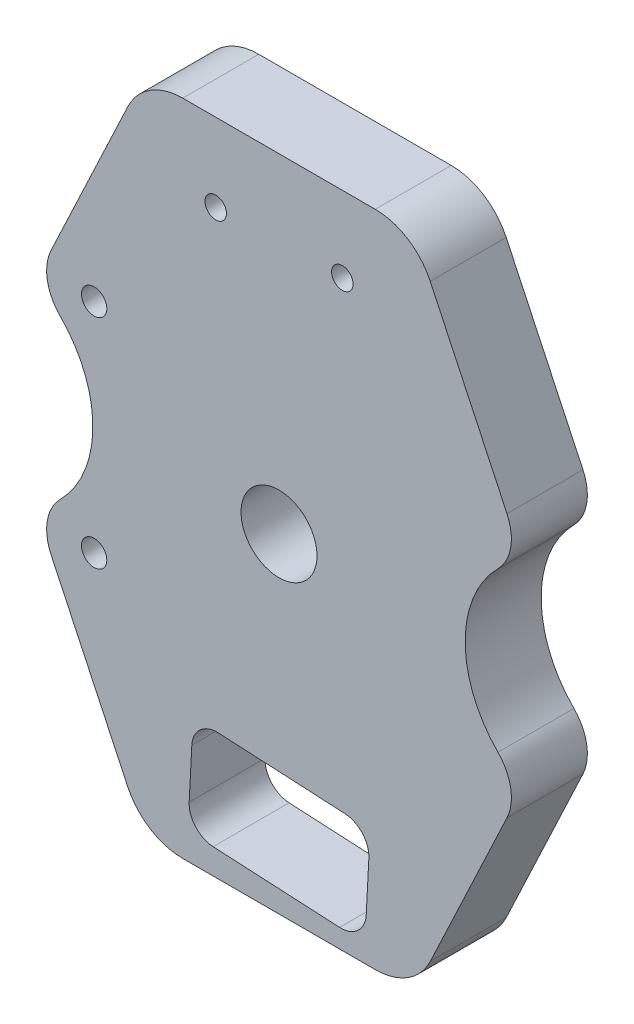
ISO-10303-21;
HEADER;
FILE_DESCRIPTION(('STEP AP214'),'2;1');
FILE_NAME('part.step','',(''),(''),'','','');
FILE_SCHEMA(('AUTOMOTIVE_DESIGN { 1 0 10303 214 1 1 1 1 }'));
ENDSEC;
DATA;
#1=APPLICATION_CONTEXT('core data for automotive mechanical design processes');
#2=APPLICATION_PROTOCOL_DEFINITION('international standard','automotive_design',2000,#1);
#3=PRODUCT_CONTEXT('',#1,'mechanical');
#4=PRODUCT('Part','Part','',(#3));
#5=PRODUCT_RELATED_PRODUCT_CATEGORY('part','',(#4));
#6=PRODUCT_DEFINITION_FORMATION('','',#4);
#7=PRODUCT_DEFINITION_CONTEXT('part definition',#1,'design');
#8=PRODUCT_DEFINITION('design','',#6,#7);
#9=PRODUCT_DEFINITION_SHAPE('','',#8);
#10=(LENGTH_UNIT() NAMED_UNIT(*) SI_UNIT(.MILLI.,.METRE.));
#11=(NAMED_UNIT(*) PLANE_ANGLE_UNIT() SI_UNIT($,.RADIAN.));
#12=(NAMED_UNIT(*) SI_UNIT($,.STERADIAN.) SOLID_ANGLE_UNIT());
#13=UNCERTAINTY_MEASURE_WITH_UNIT(LENGTH_MEASURE(1.E-05),#10,'distance_accuracy_value','');
#14=(GEOMETRIC_REPRESENTATION_CONTEXT(3) GLOBAL_UNCERTAINTY_ASSIGNED_CONTEXT((#13)) GLOBAL_UNIT_ASSIGNED_CONTEXT((#10,
#11,#12)) REPRESENTATION_CONTEXT('',''));
#15=CARTESIAN_POINT('',(0.,0.,0.));
#16=DIRECTION('',(0.,0.,1.));
#17=DIRECTION('',(1.,0.,0.));
#18=AXIS2_PLACEMENT_3D('',#15,#16,#17);
#19=CARTESIAN_POINT('',(38.0693004201398,23.9998999467089,-30.));
#20=DIRECTION('',(0.,0.,1.));
#21=DIRECTION('',(-1.,0.,0.));
#22=AXIS2_PLACEMENT_3D('',#19,#20,#21);
#23=PLANE('',#22);
#24=DIRECTION('',(-0.998629534754574,0.0523359562429441,0.));
#25=VECTOR('',#24,1.);
#26=CARTESIAN_POINT('',(-35.998752841269,10.5489732913392,-30.));
#27=LINE('',#26,#25);
#28=CARTESIAN_POINT('',(23.9190192440055,7.4088159167626,-30.));
#29=VERTEX_POINT('',#28);
#30=CARTESIAN_POINT('',(-26.0124574937233,10.0256137289098,-30.));
#31=VERTEX_POINT('',#30);
#32=EDGE_CURVE('E537',#29,#31,#27,.T.);
#33=ORIENTED_EDGE('',*,*,#32,.F.);
#34=CARTESIAN_POINT('',(24.4423788064349,17.3951112643083,-30.));
#35=DIRECTION('',(0.,0.,-1.));
#36=DIRECTION('',(-1.,0.,0.));
#37=AXIS2_PLACEMENT_3D('',#34,#35,#36);
#38=CIRCLE('',#37,10.);
#39=CARTESIAN_POINT('',(34.4286741539806,16.8717517018789,-30.));
#40=VERTEX_POINT('',#39);
#41=EDGE_CURVE('E356',#40,#29,#38,.T.);
#42=ORIENTED_EDGE('',*,*,#41,.F.);
#43=DIRECTION('',(-0.0523359562429445,-0.998629534754574,0.));
#44=VECTOR('',#43,1.);
#45=CARTESIAN_POINT('',(35.998752841269,46.830637744516,-30.));
#46=LINE('',#45,#44);
#47=CARTESIAN_POINT('',(35.4753932788395,36.8443423969703,-30.));
#48=VERTEX_POINT('',#47);
#49=EDGE_CURVE('E534',#48,#40,#46,.T.);
#50=ORIENTED_EDGE('',*,*,#49,.F.);
#51=CARTESIAN_POINT('',(25.4890979312938,37.3677019593998,-30.));
#52=DIRECTION('',(0.,0.,-1.));
#53=DIRECTION('',(-1.,0.,0.));
#54=AXIS2_PLACEMENT_3D('',#51,#52,#53);
#55=CIRCLE('',#54,10.);
#56=CARTESIAN_POINT('',(26.0124574937232,47.3539973069455,-30.));
#57=VERTEX_POINT('',#56);
#58=EDGE_CURVE('E11',#57,#48,#55,.T.);
#59=ORIENTED_EDGE('',*,*,#58,.F.);
#60=DIRECTION('',(0.998629534754574,-0.0523359562429446,0.));
#61=VECTOR('',#60,1.);
#62=CARTESIAN_POINT('',(35.998752841269,46.830637744516,-30.));
#63=LINE('',#62,#61);
#64=CARTESIAN_POINT('',(-23.9190192440055,49.9707951190927,-30.));
#65=VERTEX_POINT('',#64);
#66=EDGE_CURVE('E391',#65,#57,#63,.T.);
#67=ORIENTED_EDGE('',*,*,#66,.F.);
#68=CARTESIAN_POINT('',(-24.4423788064349,39.984499771547,-30.));
#69=DIRECTION('',(0.,0.,-1.));
#70=DIRECTION('',(-1.,0.,0.));
#71=AXIS2_PLACEMENT_3D('',#68,#69,#70);
#72=CIRCLE('',#71,10.);
#73=CARTESIAN_POINT('',(-34.4286741539807,40.5078593339764,-30.));
#74=VERTEX_POINT('',#73);
#75=EDGE_CURVE('E368',#74,#65,#72,.T.);
#76=ORIENTED_EDGE('',*,*,#75,.F.);
#77=DIRECTION('',(0.0523359562429445,0.998629534754574,0.));
#78=VECTOR('',#77,1.);
#79=CARTESIAN_POINT('',(-33.9053145915512,50.4941546815222,-30.));
#80=LINE('',#79,#78);
#81=CARTESIAN_POINT('',(-35.4753932788395,20.535268638885,-30.));
#82=VERTEX_POINT('',#81);
#83=EDGE_CURVE('E384',#82,#74,#80,.T.);
#84=ORIENTED_EDGE('',*,*,#83,.F.);
#85=CARTESIAN_POINT('',(-25.4890979312938,20.0119090764555,-30.));
#86=DIRECTION('',(0.,0.,-1.));
#87=DIRECTION('',(-1.,0.,0.));
#88=AXIS2_PLACEMENT_3D('',#85,#86,#87);
#89=CIRCLE('',#88,10.);
#90=EDGE_CURVE('E362',#31,#82,#89,.T.);
#91=ORIENTED_EDGE('',*,*,#90,.F.);
#92=EDGE_LOOP('',(#33,#42,#50,#59,#67,#76,#84,#91));
#93=FACE_BOUND('',#92,.T.);
#94=DIRECTION('',(1.,-1.29580053179329E-13,0.));
#95=VECTOR('',#94,1.);
#96=CARTESIAN_POINT('',(-38.,4.92404202081449E-12,-30.));
#97=LINE('',#96,#95);
#98=CARTESIAN_POINT('',(-38.,5.25274268525777E-12,-30.));
#99=VERTEX_POINT('',#98);
#100=CARTESIAN_POINT('',(38.0000000000001,5.61581336988582E-12,-30.));
#101=VERTEX_POINT('',#100);
#102=EDGE_CURVE('E214',#99,#101,#97,.T.);
#103=ORIENTED_EDGE('',*,*,#102,.F.);
#104=CARTESIAN_POINT('',(-38.0693004201397,23.9998999467089,-30.));
#105=DIRECTION('',(0.,0.,1.));
#106=DIRECTION('',(1.,0.,0.));
#107=AXIS2_PLACEMENT_3D('',#104,#105,#106);
#108=CIRCLE('',#107,24.0000000000003);
#109=CARTESIAN_POINT('',(-59.7661609006695,13.7409406774445,-30.));
#110=VERTEX_POINT('',#109);
#111=EDGE_CURVE('E268',#110,#99,#108,.T.);
#112=ORIENTED_EDGE('',*,*,#111,.F.);
#113=DIRECTION('',(0.426346779523004,-0.904559795475326,0.));
#114=VECTOR('',#113,1.);
#115=CARTESIAN_POINT('',(-59.7661609006695,13.7409406774445,-30.));
#116=LINE('',#115,#114);
#117=CARTESIAN_POINT('',(-90.0082162674247,77.904079068946,-30.));
#118=VERTEX_POINT('',#117);
#119=EDGE_CURVE('E265',#118,#110,#116,.T.);
#120=ORIENTED_EDGE('',*,*,#119,.F.);
#121=CARTESIAN_POINT('',(-73.5,85.6849077952408,-30.));
#122=DIRECTION('',(0.,0.,1.));
#123=DIRECTION('',(1.,0.,0.));
#124=AXIS2_PLACEMENT_3D('',#121,#122,#123);
#125=CIRCLE('',#124,18.25);
#126=CARTESIAN_POINT('',(-86.4422244101156,98.5519714586494,-30.));
#127=VERTEX_POINT('',#126);
#128=EDGE_CURVE('E262',#127,#118,#125,.T.);
#129=ORIENTED_EDGE('',*,*,#128,.F.);
#130=CARTESIAN_POINT('',(-117.999977081356,129.926455459837,-30.));
#131=DIRECTION('',(0.,0.,-1.));
#132=DIRECTION('',(-1.,0.,0.));
#133=AXIS2_PLACEMENT_3D('',#130,#131,#132);
#134=CIRCLE('',#133,44.5);
#135=CARTESIAN_POINT('',(-86.4422244101156,161.300939461025,-30.));
#136=VERTEX_POINT('',#135);
#137=EDGE_CURVE('E259',#136,#127,#134,.T.);
#138=ORIENTED_EDGE('',*,*,#137,.F.);
#139=CARTESIAN_POINT('',(-73.5,174.168003124434,-30.));
#140=DIRECTION('',(0.,0.,1.));
#141=DIRECTION('',(-1.,0.,0.));
#142=AXIS2_PLACEMENT_3D('',#139,#140,#141);
#143=CIRCLE('',#142,18.25);
#144=CARTESIAN_POINT('',(-90.0082162674247,181.948831850729,-30.));
#145=VERTEX_POINT('',#144);
#146=EDGE_CURVE('E256',#145,#136,#143,.T.);
#147=ORIENTED_EDGE('',*,*,#146,.F.);
#148=DIRECTION('',(-0.426346779523004,-0.904559795475326,0.));
#149=VECTOR('',#148,1.);
#150=CARTESIAN_POINT('',(-59.7094350914078,246.232322708552,-30.));
#151=LINE('',#150,#149);
#152=CARTESIAN_POINT('',(-59.7094350914078,246.232322708552,-30.));
#153=VERTEX_POINT('',#152);
#154=EDGE_CURVE('E253',#153,#145,#151,.T.);
#155=ORIENTED_EDGE('',*,*,#154,.F.);
#156=CARTESIAN_POINT('',(-38.,236.,-30.));
#157=DIRECTION('',(0.,0.,1.));
#158=DIRECTION('',(-1.,0.,0.));
#159=AXIS2_PLACEMENT_3D('',#156,#157,#158);
#160=CIRCLE('',#159,24.);
#161=CARTESIAN_POINT('',(-38.,260.,-30.));
#162=VERTEX_POINT('',#161);
#163=EDGE_CURVE('E250',#162,#153,#160,.T.);
#164=ORIENTED_EDGE('',*,*,#163,.F.);
#165=DIRECTION('',(-1.,0.,0.));
#166=VECTOR('',#165,1.);
#167=CARTESIAN_POINT('',(-38.,260.,-30.));
#168=LINE('',#167,#166);
#169=CARTESIAN_POINT('',(38.,260.,-30.));
#170=VERTEX_POINT('',#169);
#171=EDGE_CURVE('E247',#170,#162,#168,.T.);
#172=ORIENTED_EDGE('',*,*,#171,.F.);
#173=CARTESIAN_POINT('',(38.,236.,-30.));
#174=DIRECTION('',(0.,0.,1.));
#175=DIRECTION('',(1.,0.,0.));
#176=AXIS2_PLACEMENT_3D('',#173,#174,#175);
#177=CIRCLE('',#176,24.);
#178=CARTESIAN_POINT('',(59.7094350914078,246.232322708552,-30.));
#179=VERTEX_POINT('',#178);
#180=EDGE_CURVE('E244',#179,#170,#177,.T.);
#181=ORIENTED_EDGE('',*,*,#180,.F.);
#182=DIRECTION('',(-0.426346779523004,0.904559795475326,0.));
#183=VECTOR('',#182,1.);
#184=CARTESIAN_POINT('',(59.7094350914078,246.232322708552,-30.));
#185=LINE('',#184,#183);
#186=CARTESIAN_POINT('',(90.0082162674247,181.948831850729,-30.));
#187=VERTEX_POINT('',#186);
#188=EDGE_CURVE('E241',#187,#179,#185,.T.);
#189=ORIENTED_EDGE('',*,*,#188,.F.);
#190=CARTESIAN_POINT('',(73.5,174.168003124434,-30.));
#191=DIRECTION('',(0.,0.,1.));
#192=DIRECTION('',(1.,0.,0.));
#193=AXIS2_PLACEMENT_3D('',#190,#191,#192);
#194=CIRCLE('',#193,18.25);
#195=CARTESIAN_POINT('',(86.4422244101156,161.300939461025,-30.));
#196=VERTEX_POINT('',#195);
#197=EDGE_CURVE('E238',#196,#187,#194,.T.);
#198=ORIENTED_EDGE('',*,*,#197,.F.);
#199=CARTESIAN_POINT('',(117.999977081356,129.926455459837,-30.));
#200=DIRECTION('',(0.,0.,-1.));
#201=DIRECTION('',(1.,0.,0.));
#202=AXIS2_PLACEMENT_3D('',#199,#200,#201);
#203=CIRCLE('',#202,44.5);
#204=CARTESIAN_POINT('',(86.4422244101156,98.5519714586494,-30.));
#205=VERTEX_POINT('',#204);
#206=EDGE_CURVE('E235',#205,#196,#203,.T.);
#207=ORIENTED_EDGE('',*,*,#206,.F.);
#208=CARTESIAN_POINT('',(73.5,85.6849077952408,-30.));
#209=DIRECTION('',(0.,0.,1.));
#210=DIRECTION('',(-1.,0.,0.));
#211=AXIS2_PLACEMENT_3D('',#208,#209,#210);
#212=CIRCLE('',#211,18.25);
#213=CARTESIAN_POINT('',(90.0082162674247,77.904079068946,-30.));
#214=VERTEX_POINT('',#213);
#215=EDGE_CURVE('E232',#214,#205,#212,.T.);
#216=ORIENTED_EDGE('',*,*,#215,.F.);
#217=DIRECTION('',(0.426346779523004,0.904559795475326,0.));
#218=VECTOR('',#217,1.);
#219=CARTESIAN_POINT('',(59.7661609006696,13.7409406774445,-30.));
#220=LINE('',#219,#218);
#221=CARTESIAN_POINT('',(59.7661609006696,13.7409406774445,-30.));
#222=VERTEX_POINT('',#221);
#223=EDGE_CURVE('E217',#222,#214,#220,.T.);
#224=ORIENTED_EDGE('',*,*,#223,.F.);
#225=CARTESIAN_POINT('',(38.0693004201398,23.9998999467089,-30.));
#226=DIRECTION('',(0.,0.,1.));
#227=DIRECTION('',(-1.,0.,0.));
#228=AXIS2_PLACEMENT_3D('',#225,#226,#227);
#229=CIRCLE('',#228,24.);
#230=EDGE_CURVE('E199',#101,#222,#229,.T.);
#231=ORIENTED_EDGE('',*,*,#230,.F.);
#232=EDGE_LOOP('',(#103,#112,#120,#129,#138,#147,#155,#164,#172,#181,#189,#198,#207,#216,#224,#231));
#233=FACE_BOUND('',#232,.T.);
#234=CARTESIAN_POINT('',(0.,130.,-30.));
#235=DIRECTION('',(0.,0.,1.));
#236=DIRECTION('',(1.,0.,0.));
#237=AXIS2_PLACEMENT_3D('',#234,#235,#236);
#238=CIRCLE('',#237,15.);
#239=CARTESIAN_POINT('',(15.,130.,-30.));
#240=VERTEX_POINT('',#239);
#241=EDGE_CURVE('E272',#240,#240,#238,.T.);
#242=ORIENTED_EDGE('',*,*,#241,.T.);
#243=EDGE_LOOP('',(#242));
#244=FACE_BOUND('',#243,.T.);
#245=CARTESIAN_POINT('',(-73.,173.,-30.));
#246=DIRECTION('',(0.,0.,1.));
#247=DIRECTION('',(-1.,0.,0.));
#248=AXIS2_PLACEMENT_3D('',#245,#246,#247);
#249=CIRCLE('',#248,5.00000000000001);
#250=CARTESIAN_POINT('',(-78.,173.,-30.));
#251=VERTEX_POINT('',#250);
#252=EDGE_CURVE('E411',#251,#251,#249,.T.);
#253=ORIENTED_EDGE('',*,*,#252,.T.);
#254=EDGE_LOOP('',(#253));
#255=FACE_BOUND('',#254,.T.);
#256=CARTESIAN_POINT('',(-73.,87.,-30.));
#257=DIRECTION('',(0.,0.,1.));
#258=DIRECTION('',(1.,0.,0.));
#259=AXIS2_PLACEMENT_3D('',#256,#257,#258);
#260=CIRCLE('',#259,5.00000000000001);
#261=CARTESIAN_POINT('',(-68.,87.,-30.));
#262=VERTEX_POINT('',#261);
#263=EDGE_CURVE('E405',#262,#262,#260,.T.);
#264=ORIENTED_EDGE('',*,*,#263,.T.);
#265=EDGE_LOOP('',(#264));
#266=FACE_BOUND('',#265,.T.);
#267=CARTESIAN_POINT('',(-24.9923847578196,229.127379678136,-30.));
#268=DIRECTION('',(0.,0.,1.));
#269=DIRECTION('',(1.,0.,0.));
#270=AXIS2_PLACEMENT_3D('',#267,#268,#269);
#271=CIRCLE('',#270,4.25);
#272=CARTESIAN_POINT('',(-20.7423847578196,229.127379678136,-30.));
#273=VERTEX_POINT('',#272);
#274=EDGE_CURVE('E399',#273,#273,#271,.T.);
#275=ORIENTED_EDGE('',*,*,#274,.T.);
#276=EDGE_LOOP('',(#275));
#277=FACE_BOUND('',#276,.T.);
#278=CARTESIAN_POINT('',(25.,230.,-30.));
#279=DIRECTION('',(0.,0.,1.));
#280=DIRECTION('',(1.,0.,0.));
#281=AXIS2_PLACEMENT_3D('',#278,#279,#280);
#282=CIRCLE('',#281,4.25);
#283=CARTESIAN_POINT('',(29.25,230.,-30.));
#284=VERTEX_POINT('',#283);
#285=EDGE_CURVE('E392',#284,#284,#282,.T.);
#286=ORIENTED_EDGE('',*,*,#285,.T.);
#287=EDGE_LOOP('',(#286));
#288=FACE_BOUND('',#287,.T.);
#289=ADVANCED_FACE('F35',(#93,#233,#244,#255,#266,#277,#288),#23,.F.);
#290=CARTESIAN_POINT('',(38.0693004201398,23.9998999467089,0.));
#291=DIRECTION('',(0.,0.,1.));
#292=DIRECTION('',(-1.,0.,0.));
#293=AXIS2_PLACEMENT_3D('',#290,#291,#292);
#294=PLANE('',#293);
#295=DIRECTION('',(0.998629534754574,-0.0523359562429446,0.));
#296=VECTOR('',#295,1.);
#297=CARTESIAN_POINT('',(35.998752841269,46.830637744516,0.));
#298=LINE('',#297,#296);
#299=CARTESIAN_POINT('',(-23.9190192440055,49.9707951190927,0.));
#300=VERTEX_POINT('',#299);
#301=CARTESIAN_POINT('',(26.0124574937232,47.3539973069455,0.));
#302=VERTEX_POINT('',#301);
#303=EDGE_CURVE('E375',#300,#302,#298,.T.);
#304=ORIENTED_EDGE('',*,*,#303,.T.);
#305=CARTESIAN_POINT('',(25.4890979312938,37.3677019593998,0.));
#306=DIRECTION('',(0.,0.,-1.));
#307=DIRECTION('',(-1.,0.,0.));
#308=AXIS2_PLACEMENT_3D('',#305,#306,#307);
#309=CIRCLE('',#308,10.);
#310=CARTESIAN_POINT('',(35.4753932788395,36.8443423969703,0.));
#311=VERTEX_POINT('',#310);
#312=EDGE_CURVE('E43',#311,#302,#309,.F.);
#313=ORIENTED_EDGE('',*,*,#312,.F.);
#314=DIRECTION('',(-0.0523359562429445,-0.998629534754574,0.));
#315=VECTOR('',#314,1.);
#316=CARTESIAN_POINT('',(35.998752841269,46.830637744516,0.));
#317=LINE('',#316,#315);
#318=CARTESIAN_POINT('',(34.4286741539806,16.8717517018789,0.));
#319=VERTEX_POINT('',#318);
#320=EDGE_CURVE('E379',#311,#319,#317,.T.);
#321=ORIENTED_EDGE('',*,*,#320,.T.);
#322=CARTESIAN_POINT('',(24.4423788064349,17.3951112643083,0.));
#323=DIRECTION('',(0.,0.,-1.));
#324=DIRECTION('',(-1.,0.,0.));
#325=AXIS2_PLACEMENT_3D('',#322,#323,#324);
#326=CIRCLE('',#325,10.);
#327=CARTESIAN_POINT('',(23.9190192440055,7.4088159167626,0.));
#328=VERTEX_POINT('',#327);
#329=EDGE_CURVE('E353',#328,#319,#326,.F.);
#330=ORIENTED_EDGE('',*,*,#329,.F.);
#331=DIRECTION('',(-0.998629534754574,0.0523359562429441,0.));
#332=VECTOR('',#331,1.);
#333=CARTESIAN_POINT('',(-35.998752841269,10.5489732913392,0.));
#334=LINE('',#333,#332);
#335=CARTESIAN_POINT('',(-26.0124574937233,10.0256137289098,0.));
#336=VERTEX_POINT('',#335);
#337=EDGE_CURVE('E381',#328,#336,#334,.T.);
#338=ORIENTED_EDGE('',*,*,#337,.T.);
#339=CARTESIAN_POINT('',(-25.4890979312938,20.0119090764555,0.));
#340=DIRECTION('',(0.,0.,-1.));
#341=DIRECTION('',(-1.,0.,0.));
#342=AXIS2_PLACEMENT_3D('',#339,#340,#341);
#343=CIRCLE('',#342,10.);
#344=CARTESIAN_POINT('',(-35.4753932788395,20.535268638885,0.));
#345=VERTEX_POINT('',#344);
#346=EDGE_CURVE('E359',#345,#336,#343,.F.);
#347=ORIENTED_EDGE('',*,*,#346,.F.);
#348=DIRECTION('',(0.0523359562429445,0.998629534754574,0.));
#349=VECTOR('',#348,1.);
#350=CARTESIAN_POINT('',(-33.9053145915512,50.4941546815222,0.));
#351=LINE('',#350,#349);
#352=CARTESIAN_POINT('',(-34.4286741539807,40.5078593339764,0.));
#353=VERTEX_POINT('',#352);
#354=EDGE_CURVE('E389',#345,#353,#351,.T.);
#355=ORIENTED_EDGE('',*,*,#354,.T.);
#356=CARTESIAN_POINT('',(-24.4423788064349,39.984499771547,0.));
#357=DIRECTION('',(0.,0.,-1.));
#358=DIRECTION('',(-1.,0.,0.));
#359=AXIS2_PLACEMENT_3D('',#356,#357,#358);
#360=CIRCLE('',#359,10.);
#361=EDGE_CURVE('E365',#300,#353,#360,.F.);
#362=ORIENTED_EDGE('',*,*,#361,.F.);
#363=EDGE_LOOP('',(#304,#313,#321,#330,#338,#347,#355,#362));
#364=FACE_BOUND('',#363,.T.);
#365=CARTESIAN_POINT('',(-24.9923847578196,229.127379678136,0.));
#366=DIRECTION('',(0.,0.,1.));
#367=DIRECTION('',(1.,0.,0.));
#368=AXIS2_PLACEMENT_3D('',#365,#366,#367);
#369=CIRCLE('',#368,4.25);
#370=CARTESIAN_POINT('',(-20.7423847578196,229.127379678136,0.));
#371=VERTEX_POINT('',#370);
#372=EDGE_CURVE('E395',#371,#371,#369,.T.);
#373=ORIENTED_EDGE('',*,*,#372,.F.);
#374=EDGE_LOOP('',(#373));
#375=FACE_BOUND('',#374,.T.);
#376=CARTESIAN_POINT('',(-73.,173.,0.));
#377=DIRECTION('',(0.,0.,1.));
#378=DIRECTION('',(-1.,0.,0.));
#379=AXIS2_PLACEMENT_3D('',#376,#377,#378);
#380=CIRCLE('',#379,5.00000000000001);
#381=CARTESIAN_POINT('',(-78.,173.,0.));
#382=VERTEX_POINT('',#381);
#383=EDGE_CURVE('E408',#382,#382,#380,.T.);
#384=ORIENTED_EDGE('',*,*,#383,.F.);
#385=EDGE_LOOP('',(#384));
#386=FACE_BOUND('',#385,.T.);
#387=DIRECTION('',(1.,1.47784562365416E-13,0.));
#388=VECTOR('',#387,1.);
#389=CARTESIAN_POINT('',(0.,0.,0.));
#390=LINE('',#389,#388);
#391=CARTESIAN_POINT('',(-38.,5.25274268525777E-12,0.));
#392=VERTEX_POINT('',#391);
#393=CARTESIAN_POINT('',(38.0000000000001,5.61581336988582E-12,0.));
#394=VERTEX_POINT('',#393);
#395=EDGE_CURVE('E270',#392,#394,#390,.T.);
#396=ORIENTED_EDGE('',*,*,#395,.T.);
#397=CARTESIAN_POINT('',(38.0693004201398,23.9998999467089,0.));
#398=DIRECTION('',(0.,0.,1.));
#399=DIRECTION('',(-1.,0.,0.));
#400=AXIS2_PLACEMENT_3D('',#397,#398,#399);
#401=CIRCLE('',#400,24.);
#402=CARTESIAN_POINT('',(59.7661609006696,13.7409406774445,0.));
#403=VERTEX_POINT('',#402);
#404=EDGE_CURVE('E202',#394,#403,#401,.T.);
#405=ORIENTED_EDGE('',*,*,#404,.T.);
#406=DIRECTION('',(0.426346779523004,0.904559795475326,0.));
#407=VECTOR('',#406,1.);
#408=CARTESIAN_POINT('',(59.7661609006696,13.7409406774445,0.));
#409=LINE('',#408,#407);
#410=CARTESIAN_POINT('',(90.0082162674247,77.904079068946,0.));
#411=VERTEX_POINT('',#410);
#412=EDGE_CURVE('E274',#403,#411,#409,.T.);
#413=ORIENTED_EDGE('',*,*,#412,.T.);
#414=CARTESIAN_POINT('',(73.5,85.6849077952408,0.));
#415=DIRECTION('',(0.,0.,1.));
#416=DIRECTION('',(-1.,0.,0.));
#417=AXIS2_PLACEMENT_3D('',#414,#415,#416);
#418=CIRCLE('',#417,18.25);
#419=CARTESIAN_POINT('',(86.4422244101156,98.5519714586494,0.));
#420=VERTEX_POINT('',#419);
#421=EDGE_CURVE('E277',#411,#420,#418,.T.);
#422=ORIENTED_EDGE('',*,*,#421,.T.);
#423=CARTESIAN_POINT('',(117.999977081356,129.926455459837,0.));
#424=DIRECTION('',(0.,0.,-1.));
#425=DIRECTION('',(1.,0.,0.));
#426=AXIS2_PLACEMENT_3D('',#423,#424,#425);
#427=CIRCLE('',#426,44.5);
#428=CARTESIAN_POINT('',(86.4422244101156,161.300939461025,0.));
#429=VERTEX_POINT('',#428);
#430=EDGE_CURVE('E280',#420,#429,#427,.T.);
#431=ORIENTED_EDGE('',*,*,#430,.T.);
#432=CARTESIAN_POINT('',(73.5,174.168003124434,0.));
#433=DIRECTION('',(0.,0.,1.));
#434=DIRECTION('',(1.,0.,0.));
#435=AXIS2_PLACEMENT_3D('',#432,#433,#434);
#436=CIRCLE('',#435,18.25);
#437=CARTESIAN_POINT('',(90.0082162674247,181.948831850729,0.));
#438=VERTEX_POINT('',#437);
#439=EDGE_CURVE('E283',#429,#438,#436,.T.);
#440=ORIENTED_EDGE('',*,*,#439,.T.);
#441=DIRECTION('',(-0.426346779523004,0.904559795475326,0.));
#442=VECTOR('',#441,1.);
#443=CARTESIAN_POINT('',(59.7094350914078,246.232322708552,0.));
#444=LINE('',#443,#442);
#445=CARTESIAN_POINT('',(59.7094350914078,246.232322708552,0.));
#446=VERTEX_POINT('',#445);
#447=EDGE_CURVE('E286',#438,#446,#444,.T.);
#448=ORIENTED_EDGE('',*,*,#447,.T.);
#449=CARTESIAN_POINT('',(38.,236.,0.));
#450=DIRECTION('',(0.,0.,1.));
#451=DIRECTION('',(1.,0.,0.));
#452=AXIS2_PLACEMENT_3D('',#449,#450,#451);
#453=CIRCLE('',#452,24.);
#454=CARTESIAN_POINT('',(38.,260.,0.));
#455=VERTEX_POINT('',#454);
#456=EDGE_CURVE('E289',#446,#455,#453,.T.);
#457=ORIENTED_EDGE('',*,*,#456,.T.);
#458=DIRECTION('',(-1.,0.,0.));
#459=VECTOR('',#458,1.);
#460=CARTESIAN_POINT('',(-38.,260.,0.));
#461=LINE('',#460,#459);
#462=CARTESIAN_POINT('',(-38.,260.,0.));
#463=VERTEX_POINT('',#462);
#464=EDGE_CURVE('E292',#455,#463,#461,.T.);
#465=ORIENTED_EDGE('',*,*,#464,.T.);
#466=CARTESIAN_POINT('',(-38.,236.,0.));
#467=DIRECTION('',(0.,0.,1.));
#468=DIRECTION('',(-1.,0.,0.));
#469=AXIS2_PLACEMENT_3D('',#466,#467,#468);
#470=CIRCLE('',#469,24.);
#471=CARTESIAN_POINT('',(-59.7094350914078,246.232322708552,0.));
#472=VERTEX_POINT('',#471);
#473=EDGE_CURVE('E295',#463,#472,#470,.T.);
#474=ORIENTED_EDGE('',*,*,#473,.T.);
#475=DIRECTION('',(-0.426346779523004,-0.904559795475326,0.));
#476=VECTOR('',#475,1.);
#477=CARTESIAN_POINT('',(-59.7094350914078,246.232322708552,0.));
#478=LINE('',#477,#476);
#479=CARTESIAN_POINT('',(-90.0082162674247,181.948831850729,0.));
#480=VERTEX_POINT('',#479);
#481=EDGE_CURVE('E298',#472,#480,#478,.T.);
#482=ORIENTED_EDGE('',*,*,#481,.T.);
#483=CARTESIAN_POINT('',(-73.5,174.168003124434,0.));
#484=DIRECTION('',(0.,0.,1.));
#485=DIRECTION('',(-1.,0.,0.));
#486=AXIS2_PLACEMENT_3D('',#483,#484,#485);
#487=CIRCLE('',#486,18.25);
#488=CARTESIAN_POINT('',(-86.4422244101156,161.300939461025,0.));
#489=VERTEX_POINT('',#488);
#490=EDGE_CURVE('E301',#480,#489,#487,.T.);
#491=ORIENTED_EDGE('',*,*,#490,.T.);
#492=CARTESIAN_POINT('',(-117.999977081356,129.926455459837,0.));
#493=DIRECTION('',(0.,0.,-1.));
#494=DIRECTION('',(-1.,0.,0.));
#495=AXIS2_PLACEMENT_3D('',#492,#493,#494);
#496=CIRCLE('',#495,44.5);
#497=CARTESIAN_POINT('',(-86.4422244101156,98.5519714586494,0.));
#498=VERTEX_POINT('',#497);
#499=EDGE_CURVE('E304',#489,#498,#496,.T.);
#500=ORIENTED_EDGE('',*,*,#499,.T.);
#501=CARTESIAN_POINT('',(-73.5,85.6849077952408,0.));
#502=DIRECTION('',(0.,0.,1.));
#503=DIRECTION('',(1.,0.,0.));
#504=AXIS2_PLACEMENT_3D('',#501,#502,#503);
#505=CIRCLE('',#504,18.25);
#506=CARTESIAN_POINT('',(-90.0082162674247,77.904079068946,0.));
#507=VERTEX_POINT('',#506);
#508=EDGE_CURVE('E307',#498,#507,#505,.T.);
#509=ORIENTED_EDGE('',*,*,#508,.T.);
#510=DIRECTION('',(0.426346779523004,-0.904559795475326,0.));
#511=VECTOR('',#510,1.);
#512=CARTESIAN_POINT('',(-59.7661609006695,13.7409406774445,0.));
#513=LINE('',#512,#511);
#514=CARTESIAN_POINT('',(-59.7661609006695,13.7409406774445,0.));
#515=VERTEX_POINT('',#514);
#516=EDGE_CURVE('E225',#507,#515,#513,.T.);
#517=ORIENTED_EDGE('',*,*,#516,.T.);
#518=CARTESIAN_POINT('',(-38.0693004201397,23.9998999467089,0.));
#519=DIRECTION('',(0.,0.,1.));
#520=DIRECTION('',(1.,0.,0.));
#521=AXIS2_PLACEMENT_3D('',#518,#519,#520);
#522=CIRCLE('',#521,24.0000000000003);
#523=EDGE_CURVE('E222',#515,#392,#522,.T.);
#524=ORIENTED_EDGE('',*,*,#523,.T.);
#525=EDGE_LOOP('',(#396,#405,#413,#422,#431,#440,#448,#457,#465,#474,#482,#491,#500,#509,#517,#524));
#526=FACE_BOUND('',#525,.T.);
#527=CARTESIAN_POINT('',(0.,130.,0.));
#528=DIRECTION('',(0.,0.,1.));
#529=DIRECTION('',(1.,0.,0.));
#530=AXIS2_PLACEMENT_3D('',#527,#528,#529);
#531=CIRCLE('',#530,15.);
#532=CARTESIAN_POINT('',(15.,130.,0.));
#533=VERTEX_POINT('',#532);
#534=EDGE_CURVE('E228',#533,#533,#531,.T.);
#535=ORIENTED_EDGE('',*,*,#534,.F.);
#536=EDGE_LOOP('',(#535));
#537=FACE_BOUND('',#536,.T.);
#538=CARTESIAN_POINT('',(-73.,87.,0.));
#539=DIRECTION('',(0.,0.,1.));
#540=DIRECTION('',(1.,0.,0.));
#541=AXIS2_PLACEMENT_3D('',#538,#539,#540);
#542=CIRCLE('',#541,5.00000000000001);
#543=CARTESIAN_POINT('',(-68.,87.,0.));
#544=VERTEX_POINT('',#543);
#545=EDGE_CURVE('E402',#544,#544,#542,.T.);
#546=ORIENTED_EDGE('',*,*,#545,.F.);
#547=EDGE_LOOP('',(#546));
#548=FACE_BOUND('',#547,.T.);
#549=CARTESIAN_POINT('',(25.,230.,0.));
#550=DIRECTION('',(0.,0.,1.));
#551=DIRECTION('',(1.,0.,0.));
#552=AXIS2_PLACEMENT_3D('',#549,#550,#551);
#553=CIRCLE('',#552,4.25);
#554=CARTESIAN_POINT('',(29.25,230.,0.));
#555=VERTEX_POINT('',#554);
#556=EDGE_CURVE('E396',#555,#555,#553,.T.);
#557=ORIENTED_EDGE('',*,*,#556,.F.);
#558=EDGE_LOOP('',(#557));
#559=FACE_BOUND('',#558,.T.);
#560=ADVANCED_FACE('F376',(#364,#375,#386,#526,#537,#548,#559),#294,.T.);
#561=CARTESIAN_POINT('',(0.,0.,-30.));
#562=DIRECTION('',(-1.47784562365416E-13,1.,0.));
#563=DIRECTION('',(-1.,-1.47784562365416E-13,0.));
#564=AXIS2_PLACEMENT_3D('',#561,#562,#563);
#565=PLANE('',#564);
#566=ORIENTED_EDGE('',*,*,#395,.F.);
#567=DIRECTION('',(0.,0.,1.));
#568=VECTOR('',#567,1.);
#569=CARTESIAN_POINT('',(-38.,5.25274268525777E-12,-30.));
#570=LINE('',#569,#568);
#571=EDGE_CURVE('E220',#99,#392,#570,.T.);
#572=ORIENTED_EDGE('',*,*,#571,.F.);
#573=ORIENTED_EDGE('',*,*,#102,.T.);
#574=DIRECTION('',(0.,0.,1.));
#575=VECTOR('',#574,1.);
#576=CARTESIAN_POINT('',(38.0000000000001,5.61581336988582E-12,-30.));
#577=LINE('',#576,#575);
#578=EDGE_CURVE('E196',#101,#394,#577,.T.);
#579=ORIENTED_EDGE('',*,*,#578,.T.);
#580=EDGE_LOOP('',(#566,#572,#573,#579));
#581=FACE_BOUND('',#580,.T.);
#582=ADVANCED_FACE('F219',(#581),#565,.F.);
#583=CARTESIAN_POINT('',(38.0693004201398,23.9998999467089,-30.));
#584=DIRECTION('',(0.,0.,1.));
#585=DIRECTION('',(-1.,0.,0.));
#586=AXIS2_PLACEMENT_3D('',#583,#584,#585);
#587=CYLINDRICAL_SURFACE('',#586,24.);
#588=ORIENTED_EDGE('',*,*,#404,.F.);
#589=ORIENTED_EDGE('',*,*,#578,.F.);
#590=ORIENTED_EDGE('',*,*,#230,.T.);
#591=DIRECTION('',(0.,0.,1.));
#592=VECTOR('',#591,1.);
#593=CARTESIAN_POINT('',(59.7661609006696,13.7409406774445,-30.));
#594=LINE('',#593,#592);
#595=EDGE_CURVE('E208',#222,#403,#594,.T.);
#596=ORIENTED_EDGE('',*,*,#595,.T.);
#597=EDGE_LOOP('',(#588,#589,#590,#596));
#598=FACE_BOUND('',#597,.T.);
#599=ADVANCED_FACE('F198',(#598),#587,.T.);
#600=CARTESIAN_POINT('',(59.7661609006696,13.7409406774445,-30.));
#601=DIRECTION('',(-0.904559795475326,0.426346779523004,0.));
#602=DIRECTION('',(-0.426346779523004,-0.904559795475326,0.));
#603=AXIS2_PLACEMENT_3D('',#600,#601,#602);
#604=PLANE('',#603);
#605=ORIENTED_EDGE('',*,*,#412,.F.);
#606=ORIENTED_EDGE('',*,*,#595,.F.);
#607=ORIENTED_EDGE('',*,*,#223,.T.);
#608=DIRECTION('',(0.,0.,1.));
#609=VECTOR('',#608,1.);
#610=CARTESIAN_POINT('',(90.0082162674247,77.904079068946,-30.));
#611=LINE('',#610,#609);
#612=EDGE_CURVE('E337',#214,#411,#611,.T.);
#613=ORIENTED_EDGE('',*,*,#612,.T.);
#614=EDGE_LOOP('',(#605,#606,#607,#613));
#615=FACE_BOUND('',#614,.T.);
#616=ADVANCED_FACE('F505',(#615),#604,.F.);
#617=CARTESIAN_POINT('',(73.5,85.6849077952408,-30.));
#618=DIRECTION('',(0.,0.,1.));
#619=DIRECTION('',(-1.,0.,0.));
#620=AXIS2_PLACEMENT_3D('',#617,#618,#619);
#621=CYLINDRICAL_SURFACE('',#620,18.25);
#622=ORIENTED_EDGE('',*,*,#421,.F.);
#623=ORIENTED_EDGE('',*,*,#612,.F.);
#624=ORIENTED_EDGE('',*,*,#215,.T.);
#625=DIRECTION('',(0.,0.,1.));
#626=VECTOR('',#625,1.);
#627=CARTESIAN_POINT('',(86.4422244101156,98.5519714586494,-30.));
#628=LINE('',#627,#626);
#629=EDGE_CURVE('E335',#205,#420,#628,.T.);
#630=ORIENTED_EDGE('',*,*,#629,.T.);
#631=EDGE_LOOP('',(#622,#623,#624,#630));
#632=FACE_BOUND('',#631,.T.);
#633=ADVANCED_FACE('F501',(#632),#621,.T.);
#634=CARTESIAN_POINT('',(117.999977081356,129.926455459837,-30.));
#635=DIRECTION('',(0.,0.,1.));
#636=DIRECTION('',(-1.,0.,0.));
#637=AXIS2_PLACEMENT_3D('',#634,#635,#636);
#638=CYLINDRICAL_SURFACE('',#637,44.5);
#639=ORIENTED_EDGE('',*,*,#430,.F.);
#640=ORIENTED_EDGE('',*,*,#629,.F.);
#641=ORIENTED_EDGE('',*,*,#206,.T.);
#642=DIRECTION('',(0.,0.,1.));
#643=VECTOR('',#642,1.);
#644=CARTESIAN_POINT('',(86.4422244101156,161.300939461025,-30.));
#645=LINE('',#644,#643);
#646=EDGE_CURVE('E333',#196,#429,#645,.T.);
#647=ORIENTED_EDGE('',*,*,#646,.T.);
#648=EDGE_LOOP('',(#639,#640,#641,#647));
#649=FACE_BOUND('',#648,.T.);
#650=ADVANCED_FACE('F497',(#649),#638,.F.);
#651=CARTESIAN_POINT('',(73.5,174.168003124434,-30.));
#652=DIRECTION('',(0.,0.,1.));
#653=DIRECTION('',(-1.,0.,0.));
#654=AXIS2_PLACEMENT_3D('',#651,#652,#653);
#655=CYLINDRICAL_SURFACE('',#654,18.25);
#656=ORIENTED_EDGE('',*,*,#439,.F.);
#657=ORIENTED_EDGE('',*,*,#646,.F.);
#658=ORIENTED_EDGE('',*,*,#197,.T.);
#659=DIRECTION('',(0.,0.,1.));
#660=VECTOR('',#659,1.);
#661=CARTESIAN_POINT('',(90.0082162674247,181.948831850729,-30.));
#662=LINE('',#661,#660);
#663=EDGE_CURVE('E331',#187,#438,#662,.T.);
#664=ORIENTED_EDGE('',*,*,#663,.T.);
#665=EDGE_LOOP('',(#656,#657,#658,#664));
#666=FACE_BOUND('',#665,.T.);
#667=ADVANCED_FACE('F493',(#666),#655,.T.);
#668=CARTESIAN_POINT('',(59.7094350914078,246.232322708552,-30.));
#669=DIRECTION('',(-0.904559795475326,-0.426346779523004,0.));
#670=DIRECTION('',(0.426346779523004,-0.904559795475326,0.));
#671=AXIS2_PLACEMENT_3D('',#668,#669,#670);
#672=PLANE('',#671);
#673=ORIENTED_EDGE('',*,*,#447,.F.);
#674=ORIENTED_EDGE('',*,*,#663,.F.);
#675=ORIENTED_EDGE('',*,*,#188,.T.);
#676=DIRECTION('',(0.,0.,1.));
#677=VECTOR('',#676,1.);
#678=CARTESIAN_POINT('',(59.7094350914078,246.232322708552,-30.));
#679=LINE('',#678,#677);
#680=EDGE_CURVE('E329',#179,#446,#679,.T.);
#681=ORIENTED_EDGE('',*,*,#680,.T.);
#682=EDGE_LOOP('',(#673,#674,#675,#681));
#683=FACE_BOUND('',#682,.T.);
#684=ADVANCED_FACE('F489',(#683),#672,.F.);
#685=CARTESIAN_POINT('',(38.,236.,-30.));
#686=DIRECTION('',(0.,0.,1.));
#687=DIRECTION('',(-1.,0.,0.));
#688=AXIS2_PLACEMENT_3D('',#685,#686,#687);
#689=CYLINDRICAL_SURFACE('',#688,24.);
#690=ORIENTED_EDGE('',*,*,#456,.F.);
#691=ORIENTED_EDGE('',*,*,#680,.F.);
#692=ORIENTED_EDGE('',*,*,#180,.T.);
#693=DIRECTION('',(0.,0.,1.));
#694=VECTOR('',#693,1.);
#695=CARTESIAN_POINT('',(38.,260.,-30.));
#696=LINE('',#695,#694);
#697=EDGE_CURVE('E327',#170,#455,#696,.T.);
#698=ORIENTED_EDGE('',*,*,#697,.T.);
#699=EDGE_LOOP('',(#690,#691,#692,#698));
#700=FACE_BOUND('',#699,.T.);
#701=ADVANCED_FACE('F485',(#700),#689,.T.);
#702=CARTESIAN_POINT('',(-38.,260.,-30.));
#703=DIRECTION('',(0.,-1.,0.));
#704=DIRECTION('',(0.,0.,1.));
#705=AXIS2_PLACEMENT_3D('',#702,#703,#704);
#706=PLANE('',#705);
#707=ORIENTED_EDGE('',*,*,#464,.F.);
#708=ORIENTED_EDGE('',*,*,#697,.F.);
#709=ORIENTED_EDGE('',*,*,#171,.T.);
#710=DIRECTION('',(0.,0.,1.));
#711=VECTOR('',#710,1.);
#712=CARTESIAN_POINT('',(-38.,260.,-30.));
#713=LINE('',#712,#711);
#714=EDGE_CURVE('E325',#162,#463,#713,.T.);
#715=ORIENTED_EDGE('',*,*,#714,.T.);
#716=EDGE_LOOP('',(#707,#708,#709,#715));
#717=FACE_BOUND('',#716,.T.);
#718=ADVANCED_FACE('F481',(#717),#706,.F.);
#719=CARTESIAN_POINT('',(-38.,236.,-30.));
#720=DIRECTION('',(0.,0.,1.));
#721=DIRECTION('',(-1.,0.,0.));
#722=AXIS2_PLACEMENT_3D('',#719,#720,#721);
#723=CYLINDRICAL_SURFACE('',#722,24.);
#724=ORIENTED_EDGE('',*,*,#473,.F.);
#725=ORIENTED_EDGE('',*,*,#714,.F.);
#726=ORIENTED_EDGE('',*,*,#163,.T.);
#727=DIRECTION('',(0.,0.,1.));
#728=VECTOR('',#727,1.);
#729=CARTESIAN_POINT('',(-59.7094350914078,246.232322708552,-30.));
#730=LINE('',#729,#728);
#731=EDGE_CURVE('E323',#153,#472,#730,.T.);
#732=ORIENTED_EDGE('',*,*,#731,.T.);
#733=EDGE_LOOP('',(#724,#725,#726,#732));
#734=FACE_BOUND('',#733,.T.);
#735=ADVANCED_FACE('F477',(#734),#723,.T.);
#736=CARTESIAN_POINT('',(-59.7094350914078,246.232322708552,-30.));
#737=DIRECTION('',(0.904559795475326,-0.426346779523004,0.));
#738=DIRECTION('',(0.426346779523004,0.904559795475326,0.));
#739=AXIS2_PLACEMENT_3D('',#736,#737,#738);
#740=PLANE('',#739);
#741=ORIENTED_EDGE('',*,*,#481,.F.);
#742=ORIENTED_EDGE('',*,*,#731,.F.);
#743=ORIENTED_EDGE('',*,*,#154,.T.);
#744=DIRECTION('',(0.,0.,1.));
#745=VECTOR('',#744,1.);
#746=CARTESIAN_POINT('',(-90.0082162674247,181.948831850729,-30.));
#747=LINE('',#746,#745);
#748=EDGE_CURVE('E321',#145,#480,#747,.T.);
#749=ORIENTED_EDGE('',*,*,#748,.T.);
#750=EDGE_LOOP('',(#741,#742,#743,#749));
#751=FACE_BOUND('',#750,.T.);
#752=ADVANCED_FACE('F473',(#751),#740,.F.);
#753=CARTESIAN_POINT('',(-73.5,174.168003124434,-30.));
#754=DIRECTION('',(0.,0.,1.));
#755=DIRECTION('',(-1.,0.,0.));
#756=AXIS2_PLACEMENT_3D('',#753,#754,#755);
#757=CYLINDRICAL_SURFACE('',#756,18.25);
#758=ORIENTED_EDGE('',*,*,#490,.F.);
#759=ORIENTED_EDGE('',*,*,#748,.F.);
#760=ORIENTED_EDGE('',*,*,#146,.T.);
#761=DIRECTION('',(0.,0.,1.));
#762=VECTOR('',#761,1.);
#763=CARTESIAN_POINT('',(-86.4422244101156,161.300939461025,-30.));
#764=LINE('',#763,#762);
#765=EDGE_CURVE('E319',#136,#489,#764,.T.);
#766=ORIENTED_EDGE('',*,*,#765,.T.);
#767=EDGE_LOOP('',(#758,#759,#760,#766));
#768=FACE_BOUND('',#767,.T.);
#769=ADVANCED_FACE('F469',(#768),#757,.T.);
#770=CARTESIAN_POINT('',(-117.999977081356,129.926455459837,-30.));
#771=DIRECTION('',(0.,0.,1.));
#772=DIRECTION('',(-1.,0.,0.));
#773=AXIS2_PLACEMENT_3D('',#770,#771,#772);
#774=CYLINDRICAL_SURFACE('',#773,44.5);
#775=ORIENTED_EDGE('',*,*,#499,.F.);
#776=ORIENTED_EDGE('',*,*,#765,.F.);
#777=ORIENTED_EDGE('',*,*,#137,.T.);
#778=DIRECTION('',(0.,0.,1.));
#779=VECTOR('',#778,1.);
#780=CARTESIAN_POINT('',(-86.4422244101156,98.5519714586494,-30.));
#781=LINE('',#780,#779);
#782=EDGE_CURVE('E317',#127,#498,#781,.T.);
#783=ORIENTED_EDGE('',*,*,#782,.T.);
#784=EDGE_LOOP('',(#775,#776,#777,#783));
#785=FACE_BOUND('',#784,.T.);
#786=ADVANCED_FACE('F465',(#785),#774,.F.);
#787=CARTESIAN_POINT('',(-73.5,85.6849077952408,-30.));
#788=DIRECTION('',(0.,0.,1.));
#789=DIRECTION('',(-1.,0.,0.));
#790=AXIS2_PLACEMENT_3D('',#787,#788,#789);
#791=CYLINDRICAL_SURFACE('',#790,18.25);
#792=ORIENTED_EDGE('',*,*,#508,.F.);
#793=ORIENTED_EDGE('',*,*,#782,.F.);
#794=ORIENTED_EDGE('',*,*,#128,.T.);
#795=DIRECTION('',(0.,0.,1.));
#796=VECTOR('',#795,1.);
#797=CARTESIAN_POINT('',(-90.0082162674247,77.904079068946,-30.));
#798=LINE('',#797,#796);
#799=EDGE_CURVE('E315',#118,#507,#798,.T.);
#800=ORIENTED_EDGE('',*,*,#799,.T.);
#801=EDGE_LOOP('',(#792,#793,#794,#800));
#802=FACE_BOUND('',#801,.T.);
#803=ADVANCED_FACE('F461',(#802),#791,.T.);
#804=CARTESIAN_POINT('',(-59.7661609006695,13.7409406774445,-30.));
#805=DIRECTION('',(0.904559795475326,0.426346779523004,0.));
#806=DIRECTION('',(-0.426346779523004,0.904559795475326,0.));
#807=AXIS2_PLACEMENT_3D('',#804,#805,#806);
#808=PLANE('',#807);
#809=ORIENTED_EDGE('',*,*,#516,.F.);
#810=ORIENTED_EDGE('',*,*,#799,.F.);
#811=ORIENTED_EDGE('',*,*,#119,.T.);
#812=DIRECTION('',(0.,0.,1.));
#813=VECTOR('',#812,1.);
#814=CARTESIAN_POINT('',(-59.7661609006695,13.7409406774445,-30.));
#815=LINE('',#814,#813);
#816=EDGE_CURVE('E313',#110,#515,#815,.T.);
#817=ORIENTED_EDGE('',*,*,#816,.T.);
#818=EDGE_LOOP('',(#809,#810,#811,#817));
#819=FACE_BOUND('',#818,.T.);
#820=ADVANCED_FACE('F457',(#819),#808,.F.);
#821=CARTESIAN_POINT('',(-38.0693004201397,23.9998999467089,-30.));
#822=DIRECTION('',(0.,0.,1.));
#823=DIRECTION('',(-1.,0.,0.));
#824=AXIS2_PLACEMENT_3D('',#821,#822,#823);
#825=CYLINDRICAL_SURFACE('',#824,24.0000000000003);
#826=ORIENTED_EDGE('',*,*,#523,.F.);
#827=ORIENTED_EDGE('',*,*,#816,.F.);
#828=ORIENTED_EDGE('',*,*,#111,.T.);
#829=ORIENTED_EDGE('',*,*,#571,.T.);
#830=EDGE_LOOP('',(#826,#827,#828,#829));
#831=FACE_BOUND('',#830,.T.);
#832=ADVANCED_FACE('F454',(#831),#825,.T.);
#833=CARTESIAN_POINT('',(0.,130.,-30.));
#834=DIRECTION('',(0.,0.,1.));
#835=DIRECTION('',(-1.,0.,0.));
#836=AXIS2_PLACEMENT_3D('',#833,#834,#835);
#837=CYLINDRICAL_SURFACE('',#836,15.);
#838=ORIENTED_EDGE('',*,*,#241,.F.);
#839=EDGE_LOOP('',(#838));
#840=FACE_BOUND('',#839,.T.);
#841=ORIENTED_EDGE('',*,*,#534,.T.);
#842=EDGE_LOOP('',(#841));
#843=FACE_BOUND('',#842,.T.);
#844=ADVANCED_FACE('F420',(#840,#843),#837,.F.);
#845=CARTESIAN_POINT('',(-73.,173.,-30.));
#846=DIRECTION('',(0.,0.,1.));
#847=DIRECTION('',(-1.,0.,0.));
#848=AXIS2_PLACEMENT_3D('',#845,#846,#847);
#849=CYLINDRICAL_SURFACE('',#848,5.00000000000001);
#850=ORIENTED_EDGE('',*,*,#252,.F.);
#851=EDGE_LOOP('',(#850));
#852=FACE_BOUND('',#851,.T.);
#853=ORIENTED_EDGE('',*,*,#383,.T.);
#854=EDGE_LOOP('',(#853));
#855=FACE_BOUND('',#854,.T.);
#856=ADVANCED_FACE('F617',(#852,#855),#849,.F.);
#857=CARTESIAN_POINT('',(-73.,87.,-30.));
#858=DIRECTION('',(0.,0.,1.));
#859=DIRECTION('',(-1.,0.,0.));
#860=AXIS2_PLACEMENT_3D('',#857,#858,#859);
#861=CYLINDRICAL_SURFACE('',#860,5.00000000000001);
#862=ORIENTED_EDGE('',*,*,#263,.F.);
#863=EDGE_LOOP('',(#862));
#864=FACE_BOUND('',#863,.T.);
#865=ORIENTED_EDGE('',*,*,#545,.T.);
#866=EDGE_LOOP('',(#865));
#867=FACE_BOUND('',#866,.T.);
#868=ADVANCED_FACE('F441',(#864,#867),#861,.F.);
#869=CARTESIAN_POINT('',(-24.9923847578196,229.127379678136,-30.));
#870=DIRECTION('',(0.,0.,1.));
#871=DIRECTION('',(-1.,0.,0.));
#872=AXIS2_PLACEMENT_3D('',#869,#870,#871);
#873=CYLINDRICAL_SURFACE('',#872,4.25);
#874=ORIENTED_EDGE('',*,*,#274,.F.);
#875=EDGE_LOOP('',(#874));
#876=FACE_BOUND('',#875,.T.);
#877=ORIENTED_EDGE('',*,*,#372,.T.);
#878=EDGE_LOOP('',(#877));
#879=FACE_BOUND('',#878,.T.);
#880=ADVANCED_FACE('F432',(#876,#879),#873,.F.);
#881=CARTESIAN_POINT('',(25.,230.,-30.));
#882=DIRECTION('',(0.,0.,1.));
#883=DIRECTION('',(-1.,0.,0.));
#884=AXIS2_PLACEMENT_3D('',#881,#882,#883);
#885=CYLINDRICAL_SURFACE('',#884,4.25);
#886=ORIENTED_EDGE('',*,*,#285,.F.);
#887=EDGE_LOOP('',(#886));
#888=FACE_BOUND('',#887,.T.);
#889=ORIENTED_EDGE('',*,*,#556,.T.);
#890=EDGE_LOOP('',(#889));
#891=FACE_BOUND('',#890,.T.);
#892=ADVANCED_FACE('F429',(#888,#891),#885,.F.);
#893=CARTESIAN_POINT('',(35.998752841269,46.830637744516,-30.));
#894=DIRECTION('',(0.0523359562429446,0.998629534754574,0.));
#895=DIRECTION('',(-0.998629534754574,0.0523359562429446,0.));
#896=AXIS2_PLACEMENT_3D('',#893,#894,#895);
#897=PLANE('',#896);
#898=ORIENTED_EDGE('',*,*,#66,.T.);
#899=DIRECTION('',(0.,0.,1.));
#900=VECTOR('',#899,1.);
#901=CARTESIAN_POINT('',(26.0124574937232,47.3539973069455,-30.));
#902=LINE('',#901,#900);
#903=EDGE_CURVE('E49',#302,#57,#902,.F.);
#904=ORIENTED_EDGE('',*,*,#903,.F.);
#905=ORIENTED_EDGE('',*,*,#303,.F.);
#906=DIRECTION('',(0.,0.,1.));
#907=VECTOR('',#906,1.);
#908=CARTESIAN_POINT('',(-23.9190192440055,49.9707951190927,0.));
#909=LINE('',#908,#907);
#910=EDGE_CURVE('E56',#65,#300,#909,.T.);
#911=ORIENTED_EDGE('',*,*,#910,.F.);
#912=EDGE_LOOP('',(#898,#904,#905,#911));
#913=FACE_BOUND('',#912,.T.);
#914=ADVANCED_FACE('F431',(#913),#897,.F.);
#915=CARTESIAN_POINT('',(-33.9053145915512,50.4941546815222,-30.));
#916=DIRECTION('',(-0.998629534754574,0.0523359562429445,0.));
#917=DIRECTION('',(-0.0523359562429445,-0.998629534754574,0.));
#918=AXIS2_PLACEMENT_3D('',#915,#916,#917);
#919=PLANE('',#918);
#920=ORIENTED_EDGE('',*,*,#83,.T.);
#921=DIRECTION('',(0.,0.,1.));
#922=VECTOR('',#921,1.);
#923=CARTESIAN_POINT('',(-34.4286741539807,40.5078593339764,-30.));
#924=LINE('',#923,#922);
#925=EDGE_CURVE('E347',#353,#74,#924,.F.);
#926=ORIENTED_EDGE('',*,*,#925,.F.);
#927=ORIENTED_EDGE('',*,*,#354,.F.);
#928=DIRECTION('',(0.,0.,1.));
#929=VECTOR('',#928,1.);
#930=CARTESIAN_POINT('',(-35.4753932788395,20.535268638885,0.));
#931=LINE('',#930,#929);
#932=EDGE_CURVE('E349',#82,#345,#931,.T.);
#933=ORIENTED_EDGE('',*,*,#932,.F.);
#934=EDGE_LOOP('',(#920,#926,#927,#933));
#935=FACE_BOUND('',#934,.T.);
#936=ADVANCED_FACE('F439',(#935),#919,.F.);
#937=CARTESIAN_POINT('',(-35.998752841269,10.5489732913392,-30.));
#938=DIRECTION('',(-0.0523359562429441,-0.998629534754574,0.));
#939=DIRECTION('',(0.998629534754574,-0.0523359562429441,0.));
#940=AXIS2_PLACEMENT_3D('',#937,#938,#939);
#941=PLANE('',#940);
#942=ORIENTED_EDGE('',*,*,#32,.T.);
#943=DIRECTION('',(0.,0.,1.));
#944=VECTOR('',#943,1.);
#945=CARTESIAN_POINT('',(-26.0124574937233,10.0256137289098,-30.));
#946=LINE('',#945,#944);
#947=EDGE_CURVE('E207',#336,#31,#946,.F.);
#948=ORIENTED_EDGE('',*,*,#947,.F.);
#949=ORIENTED_EDGE('',*,*,#337,.F.);
#950=DIRECTION('',(0.,0.,1.));
#951=VECTOR('',#950,1.);
#952=CARTESIAN_POINT('',(23.9190192440055,7.4088159167626,0.));
#953=LINE('',#952,#951);
#954=EDGE_CURVE('E341',#29,#328,#953,.T.);
#955=ORIENTED_EDGE('',*,*,#954,.F.);
#956=EDGE_LOOP('',(#942,#948,#949,#955));
#957=FACE_BOUND('',#956,.T.);
#958=ADVANCED_FACE('F547',(#957),#941,.F.);
#959=CARTESIAN_POINT('',(35.998752841269,46.830637744516,-30.));
#960=DIRECTION('',(0.998629534754574,-0.0523359562429445,0.));
#961=DIRECTION('',(0.0523359562429445,0.998629534754574,0.));
#962=AXIS2_PLACEMENT_3D('',#959,#960,#961);
#963=PLANE('',#962);
#964=ORIENTED_EDGE('',*,*,#320,.F.);
#965=DIRECTION('',(0.,0.,1.));
#966=VECTOR('',#965,1.);
#967=CARTESIAN_POINT('',(35.4753932788395,36.8443423969703,0.));
#968=LINE('',#967,#966);
#969=EDGE_CURVE('E343',#48,#311,#968,.T.);
#970=ORIENTED_EDGE('',*,*,#969,.F.);
#971=ORIENTED_EDGE('',*,*,#49,.T.);
#972=DIRECTION('',(0.,0.,1.));
#973=VECTOR('',#972,1.);
#974=CARTESIAN_POINT('',(34.4286741539806,16.8717517018789,-30.));
#975=LINE('',#974,#973);
#976=EDGE_CURVE('E345',#319,#40,#975,.F.);
#977=ORIENTED_EDGE('',*,*,#976,.F.);
#978=EDGE_LOOP('',(#964,#970,#971,#977));
#979=FACE_BOUND('',#978,.T.);
#980=ADVANCED_FACE('F518',(#979),#963,.F.);
#981=CARTESIAN_POINT('',(24.4423788064349,17.3951112643083,-30.));
#982=DIRECTION('',(0.,0.,-1.));
#983=DIRECTION('',(1.,0.,0.));
#984=AXIS2_PLACEMENT_3D('',#981,#982,#983);
#985=CYLINDRICAL_SURFACE('',#984,10.);
#986=ORIENTED_EDGE('',*,*,#41,.T.);
#987=ORIENTED_EDGE('',*,*,#954,.T.);
#988=ORIENTED_EDGE('',*,*,#329,.T.);
#989=ORIENTED_EDGE('',*,*,#976,.T.);
#990=EDGE_LOOP('',(#986,#987,#988,#989));
#991=FACE_BOUND('',#990,.T.);
#992=ADVANCED_FACE('F514',(#991),#985,.F.);
#993=CARTESIAN_POINT('',(-25.4890979312938,20.0119090764555,-30.));
#994=DIRECTION('',(0.,0.,-1.));
#995=DIRECTION('',(1.,0.,0.));
#996=AXIS2_PLACEMENT_3D('',#993,#994,#995);
#997=CYLINDRICAL_SURFACE('',#996,10.);
#998=ORIENTED_EDGE('',*,*,#90,.T.);
#999=ORIENTED_EDGE('',*,*,#932,.T.);
#1000=ORIENTED_EDGE('',*,*,#346,.T.);
#1001=ORIENTED_EDGE('',*,*,#947,.T.);
#1002=EDGE_LOOP('',(#998,#999,#1000,#1001));
#1003=FACE_BOUND('',#1002,.T.);
#1004=ADVANCED_FACE('F517',(#1003),#997,.F.);
#1005=CARTESIAN_POINT('',(-24.4423788064349,39.984499771547,-30.));
#1006=DIRECTION('',(0.,0.,-1.));
#1007=DIRECTION('',(1.,0.,0.));
#1008=AXIS2_PLACEMENT_3D('',#1005,#1006,#1007);
#1009=CYLINDRICAL_SURFACE('',#1008,10.);
#1010=ORIENTED_EDGE('',*,*,#75,.T.);
#1011=ORIENTED_EDGE('',*,*,#910,.T.);
#1012=ORIENTED_EDGE('',*,*,#361,.T.);
#1013=ORIENTED_EDGE('',*,*,#925,.T.);
#1014=EDGE_LOOP('',(#1010,#1011,#1012,#1013));
#1015=FACE_BOUND('',#1014,.T.);
#1016=ADVANCED_FACE('F521',(#1015),#1009,.F.);
#1017=CARTESIAN_POINT('',(25.4890979312938,37.3677019593998,-30.));
#1018=DIRECTION('',(0.,0.,-1.));
#1019=DIRECTION('',(1.,0.,0.));
#1020=AXIS2_PLACEMENT_3D('',#1017,#1018,#1019);
#1021=CYLINDRICAL_SURFACE('',#1020,10.);
#1022=ORIENTED_EDGE('',*,*,#58,.T.);
#1023=ORIENTED_EDGE('',*,*,#969,.T.);
#1024=ORIENTED_EDGE('',*,*,#312,.T.);
#1025=ORIENTED_EDGE('',*,*,#903,.T.);
#1026=EDGE_LOOP('',(#1022,#1023,#1024,#1025));
#1027=FACE_BOUND('',#1026,.T.);
#1028=ADVANCED_FACE('F37',(#1027),#1021,.F.);
#1029=CLOSED_SHELL('',(#289,#560,#582,#599,#616,#633,#650,#667,#684,#701,#718,#735,#752,#769,
#786,#803,#820,#832,#844,#856,#868,#880,#892,#914,#936,#958,#980,#992,#1004,#1016,#1028));
#1030=MANIFOLD_SOLID_BREP('B2',#1029);
#1031=ADVANCED_BREP_SHAPE_REPRESENTATION('',(#18,#1030),#14);
#1032=SHAPE_DEFINITION_REPRESENTATION(#9,#1031);
ENDSEC;
END-ISO-10303-21;
